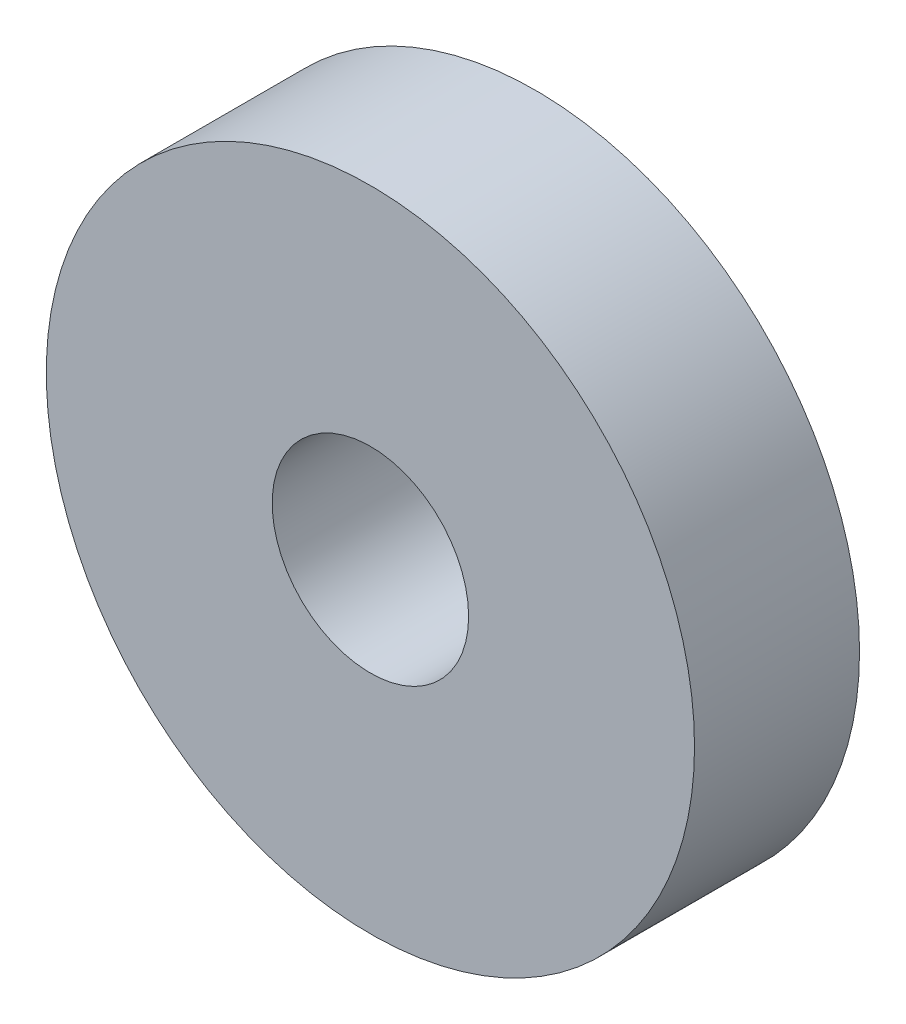
ISO-10303-21;
HEADER;
FILE_DESCRIPTION(('STEP AP214'),'2;1');
FILE_NAME('part.step','',(''),(''),'','','');
FILE_SCHEMA(('AUTOMOTIVE_DESIGN { 1 0 10303 214 1 1 1 1 }'));
ENDSEC;
DATA;
#1=APPLICATION_CONTEXT('core data for automotive mechanical design processes');
#2=APPLICATION_PROTOCOL_DEFINITION('international standard','automotive_design',2000,#1);
#3=PRODUCT_CONTEXT('',#1,'mechanical');
#4=PRODUCT('Part','Part','',(#3));
#5=PRODUCT_RELATED_PRODUCT_CATEGORY('part','',(#4));
#6=PRODUCT_DEFINITION_FORMATION('','',#4);
#7=PRODUCT_DEFINITION_CONTEXT('part definition',#1,'design');
#8=PRODUCT_DEFINITION('design','',#6,#7);
#9=PRODUCT_DEFINITION_SHAPE('','',#8);
#10=(LENGTH_UNIT() NAMED_UNIT(*) SI_UNIT(.MILLI.,.METRE.));
#11=(NAMED_UNIT(*) PLANE_ANGLE_UNIT() SI_UNIT($,.RADIAN.));
#12=(NAMED_UNIT(*) SI_UNIT($,.STERADIAN.) SOLID_ANGLE_UNIT());
#13=UNCERTAINTY_MEASURE_WITH_UNIT(LENGTH_MEASURE(1.E-05),#10,'distance_accuracy_value','');
#14=(GEOMETRIC_REPRESENTATION_CONTEXT(3) GLOBAL_UNCERTAINTY_ASSIGNED_CONTEXT((#13)) GLOBAL_UNIT_ASSIGNED_CONTEXT((#10,
#11,#12)) REPRESENTATION_CONTEXT('',''));
#15=CARTESIAN_POINT('',(0.,0.,0.));
#16=DIRECTION('',(0.,0.,1.));
#17=DIRECTION('',(1.,0.,0.));
#18=AXIS2_PLACEMENT_3D('',#15,#16,#17);
#19=CARTESIAN_POINT('',(0.,0.,2.));
#20=DIRECTION('',(0.,0.,1.));
#21=DIRECTION('',(1.,0.,0.));
#22=AXIS2_PLACEMENT_3D('',#19,#20,#21);
#23=PLANE('',#22);
#24=CARTESIAN_POINT('',(0.,0.,2.));
#25=DIRECTION('',(0.,0.,1.));
#26=DIRECTION('',(1.,0.,0.));
#27=AXIS2_PLACEMENT_3D('',#24,#25,#26);
#28=CIRCLE('',#27,7.85779785398388);
#29=CARTESIAN_POINT('',(7.85779785398388,0.,2.));
#30=VERTEX_POINT('',#29);
#31=EDGE_CURVE('E10',#30,#30,#28,.T.);
#32=ORIENTED_EDGE('',*,*,#31,.T.);
#33=EDGE_LOOP('',(#32));
#34=FACE_BOUND('',#33,.T.);
#35=CARTESIAN_POINT('',(0.,0.,2.));
#36=DIRECTION('',(0.,0.,1.));
#37=DIRECTION('',(1.,0.,0.));
#38=AXIS2_PLACEMENT_3D('',#35,#36,#37);
#39=CIRCLE('',#38,2.38125);
#40=CARTESIAN_POINT('',(2.38125,0.,2.));
#41=VERTEX_POINT('',#40);
#42=EDGE_CURVE('E44',#41,#41,#39,.T.);
#43=ORIENTED_EDGE('',*,*,#42,.F.);
#44=EDGE_LOOP('',(#43));
#45=FACE_BOUND('',#44,.T.);
#46=ADVANCED_FACE('F33',(#34,#45),#23,.T.);
#47=CARTESIAN_POINT('',(0.,0.,-2.));
#48=DIRECTION('',(0.,0.,1.));
#49=DIRECTION('',(1.,0.,0.));
#50=AXIS2_PLACEMENT_3D('',#47,#48,#49);
#51=PLANE('',#50);
#52=CARTESIAN_POINT('',(0.,0.,-2.));
#53=DIRECTION('',(0.,0.,1.));
#54=DIRECTION('',(1.,0.,0.));
#55=AXIS2_PLACEMENT_3D('',#52,#53,#54);
#56=CIRCLE('',#55,7.85779785398388);
#57=CARTESIAN_POINT('',(7.85779785398388,0.,-2.));
#58=VERTEX_POINT('',#57);
#59=EDGE_CURVE('E37',#58,#58,#56,.T.);
#60=ORIENTED_EDGE('',*,*,#59,.F.);
#61=EDGE_LOOP('',(#60));
#62=FACE_BOUND('',#61,.T.);
#63=CARTESIAN_POINT('',(0.,0.,-2.));
#64=DIRECTION('',(0.,0.,1.));
#65=DIRECTION('',(1.,0.,0.));
#66=AXIS2_PLACEMENT_3D('',#63,#64,#65);
#67=CIRCLE('',#66,2.38125);
#68=CARTESIAN_POINT('',(2.38125,0.,-2.));
#69=VERTEX_POINT('',#68);
#70=EDGE_CURVE('E46',#69,#69,#67,.T.);
#71=ORIENTED_EDGE('',*,*,#70,.T.);
#72=EDGE_LOOP('',(#71));
#73=FACE_BOUND('',#72,.T.);
#74=ADVANCED_FACE('F56',(#62,#73),#51,.F.);
#75=CARTESIAN_POINT('',(0.,0.,2.));
#76=DIRECTION('',(0.,0.,-1.));
#77=DIRECTION('',(-1.,0.,0.));
#78=AXIS2_PLACEMENT_3D('',#75,#76,#77);
#79=CYLINDRICAL_SURFACE('',#78,7.85779785398388);
#80=ORIENTED_EDGE('',*,*,#31,.F.);
#81=EDGE_LOOP('',(#80));
#82=FACE_BOUND('',#81,.T.);
#83=ORIENTED_EDGE('',*,*,#59,.T.);
#84=EDGE_LOOP('',(#83));
#85=FACE_BOUND('',#84,.T.);
#86=ADVANCED_FACE('F35',(#82,#85),#79,.T.);
#87=CARTESIAN_POINT('',(0.,0.,2.));
#88=DIRECTION('',(0.,0.,-1.));
#89=DIRECTION('',(-1.,0.,0.));
#90=AXIS2_PLACEMENT_3D('',#87,#88,#89);
#91=CYLINDRICAL_SURFACE('',#90,2.38125);
#92=ORIENTED_EDGE('',*,*,#42,.T.);
#93=EDGE_LOOP('',(#92));
#94=FACE_BOUND('',#93,.T.);
#95=ORIENTED_EDGE('',*,*,#70,.F.);
#96=EDGE_LOOP('',(#95));
#97=FACE_BOUND('',#96,.T.);
#98=ADVANCED_FACE('F52',(#94,#97),#91,.F.);
#99=CLOSED_SHELL('',(#46,#74,#86,#98));
#100=MANIFOLD_SOLID_BREP('B2',#99);
#101=ADVANCED_BREP_SHAPE_REPRESENTATION('',(#18,#100),#14);
#102=SHAPE_DEFINITION_REPRESENTATION(#9,#101);
ENDSEC;
END-ISO-10303-21;
